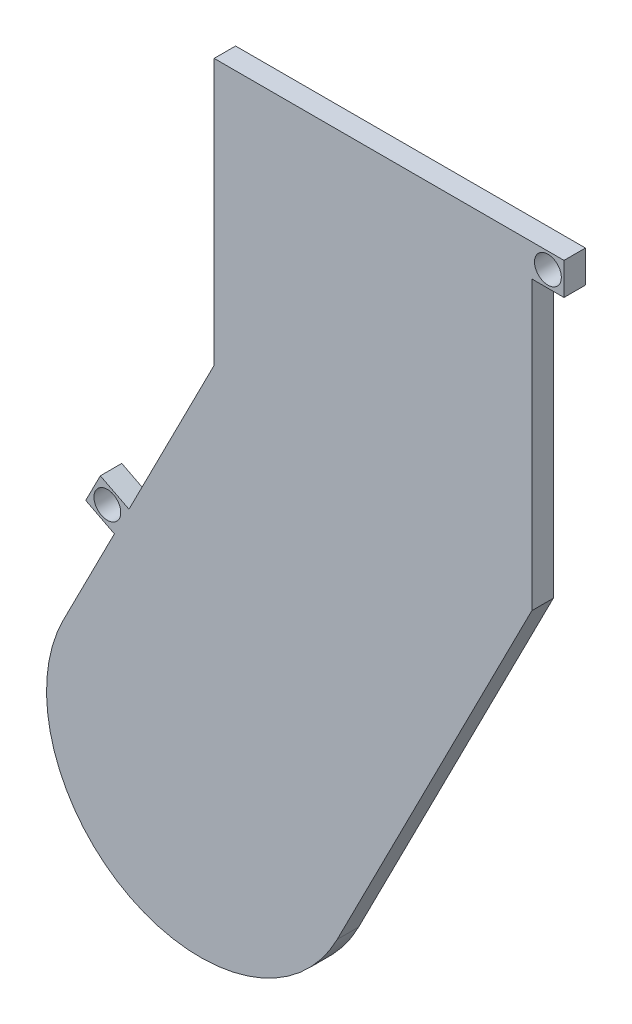
ISO-10303-21;
HEADER;
FILE_DESCRIPTION(('STEP AP214'),'2;1');
FILE_NAME('part.step','',(''),(''),'','','');
FILE_SCHEMA(('AUTOMOTIVE_DESIGN { 1 0 10303 214 1 1 1 1 }'));
ENDSEC;
DATA;
#1=APPLICATION_CONTEXT('core data for automotive mechanical design processes');
#2=APPLICATION_PROTOCOL_DEFINITION('international standard','automotive_design',2000,#1);
#3=PRODUCT_CONTEXT('',#1,'mechanical');
#4=PRODUCT('Part','Part','',(#3));
#5=PRODUCT_RELATED_PRODUCT_CATEGORY('part','',(#4));
#6=PRODUCT_DEFINITION_FORMATION('','',#4);
#7=PRODUCT_DEFINITION_CONTEXT('part definition',#1,'design');
#8=PRODUCT_DEFINITION('design','',#6,#7);
#9=PRODUCT_DEFINITION_SHAPE('','',#8);
#10=(LENGTH_UNIT() NAMED_UNIT(*) SI_UNIT(.MILLI.,.METRE.));
#11=(NAMED_UNIT(*) PLANE_ANGLE_UNIT() SI_UNIT($,.RADIAN.));
#12=(NAMED_UNIT(*) SI_UNIT($,.STERADIAN.) SOLID_ANGLE_UNIT());
#13=UNCERTAINTY_MEASURE_WITH_UNIT(LENGTH_MEASURE(1.E-05),#10,'distance_accuracy_value','');
#14=(GEOMETRIC_REPRESENTATION_CONTEXT(3) GLOBAL_UNCERTAINTY_ASSIGNED_CONTEXT((#13)) GLOBAL_UNIT_ASSIGNED_CONTEXT((#10,
#11,#12)) REPRESENTATION_CONTEXT('',''));
#15=CARTESIAN_POINT('',(0.,0.,0.));
#16=DIRECTION('',(0.,0.,1.));
#17=DIRECTION('',(1.,0.,0.));
#18=AXIS2_PLACEMENT_3D('',#15,#16,#17);
#19=CARTESIAN_POINT('',(-78.5756383656822,-149.684058286065,5.08));
#20=DIRECTION('',(0.,0.,1.));
#21=DIRECTION('',(1.,0.,0.));
#22=AXIS2_PLACEMENT_3D('',#19,#20,#21);
#23=PLANE('',#22);
#24=CARTESIAN_POINT('',(3.81,-3.81,5.08));
#25=DIRECTION('',(0.,0.,1.));
#26=DIRECTION('',(1.,0.,0.));
#27=AXIS2_PLACEMENT_3D('',#24,#25,#26);
#28=CIRCLE('',#27,3.175);
#29=CARTESIAN_POINT('',(6.985,-3.81,5.08));
#30=VERTEX_POINT('',#29);
#31=EDGE_CURVE('E170',#30,#30,#28,.T.);
#32=ORIENTED_EDGE('',*,*,#31,.F.);
#33=EDGE_LOOP('',(#32));
#34=FACE_BOUND('',#33,.T.);
#35=DIRECTION('',(-0.453990499739548,-0.891006524188367,0.));
#36=VECTOR('',#35,1.);
#37=CARTESIAN_POINT('',(-75.2786300083344,-62.992,5.08));
#38=LINE('',#37,#36);
#39=CARTESIAN_POINT('',(-75.2786300083344,-62.992,5.08));
#40=VERTEX_POINT('',#39);
#41=CARTESIAN_POINT('',(-95.4585077217573,-102.597240000173,5.08));
#42=VERTEX_POINT('',#41);
#43=EDGE_CURVE('E200',#40,#42,#38,.T.);
#44=ORIENTED_EDGE('',*,*,#43,.T.);
#45=DIRECTION('',(-0.891006524188368,0.453990499739547,0.));
#46=VECTOR('',#45,1.);
#47=CARTESIAN_POINT('',(-95.4585077217573,-102.597240000173,5.08));
#48=LINE('',#47,#46);
#49=CARTESIAN_POINT('',(-102.247977436073,-99.1378323921576,5.08));
#50=VERTEX_POINT('',#49);
#51=EDGE_CURVE('E111',#42,#50,#48,.T.);
#52=ORIENTED_EDGE('',*,*,#51,.T.);
#53=DIRECTION('',(-0.453990499739546,-0.891006524188368,0.));
#54=VECTOR('',#53,1.);
#55=CARTESIAN_POINT('',(-102.247977436073,-99.1378323921576,5.08));
#56=LINE('',#55,#54);
#57=CARTESIAN_POINT('',(-105.707385044088,-105.927302106473,5.08));
#58=VERTEX_POINT('',#57);
#59=EDGE_CURVE('E237',#50,#58,#56,.T.);
#60=ORIENTED_EDGE('',*,*,#59,.T.);
#61=DIRECTION('',(0.891006524188366,-0.453990499739552,0.));
#62=VECTOR('',#61,1.);
#63=CARTESIAN_POINT('',(-105.707385044088,-105.927302106473,5.08));
#64=LINE('',#63,#62);
#65=CARTESIAN_POINT('',(-98.9179153297727,-109.386709714488,5.08));
#66=VERTEX_POINT('',#65);
#67=EDGE_CURVE('E257',#58,#66,#64,.T.);
#68=ORIENTED_EDGE('',*,*,#67,.T.);
#69=DIRECTION('',(-0.453990499739547,-0.891006524188368,0.));
#70=VECTOR('',#69,1.);
#71=CARTESIAN_POINT('',(-98.9179153297727,-109.386709714488,5.08));
#72=LINE('',#71,#70);
#73=CARTESIAN_POINT('',(-111.025841957826,-133.149853714592,5.08));
#74=VERTEX_POINT('',#73);
#75=EDGE_CURVE('E253',#66,#74,#72,.T.);
#76=ORIENTED_EDGE('',*,*,#75,.T.);
#77=CARTESIAN_POINT('',(-78.5756383656822,-149.684058286065,5.08));
#78=DIRECTION('',(0.,0.,1.));
#79=DIRECTION('',(1.,0.,0.));
#80=AXIS2_PLACEMENT_3D('',#77,#78,#79);
#81=CIRCLE('',#80,36.4197149080402);
#82=CARTESIAN_POINT('',(-46.1254347735381,-166.218262857538,5.08));
#83=VERTEX_POINT('',#82);
#84=EDGE_CURVE('E256',#74,#83,#81,.T.);
#85=ORIENTED_EDGE('',*,*,#84,.T.);
#86=DIRECTION('',(0.453990499739548,0.891006524188368,0.));
#87=VECTOR('',#86,1.);
#88=CARTESIAN_POINT('',(0.,-75.692,5.08));
#89=LINE('',#88,#87);
#90=CARTESIAN_POINT('',(0.,-75.692,5.08));
#91=VERTEX_POINT('',#90);
#92=EDGE_CURVE('E261',#83,#91,#89,.T.);
#93=ORIENTED_EDGE('',*,*,#92,.T.);
#94=DIRECTION('',(0.,1.,0.));
#95=VECTOR('',#94,1.);
#96=CARTESIAN_POINT('',(0.,-7.62,5.08));
#97=LINE('',#96,#95);
#98=CARTESIAN_POINT('',(0.,-7.62,5.08));
#99=VERTEX_POINT('',#98);
#100=EDGE_CURVE('E268',#91,#99,#97,.T.);
#101=ORIENTED_EDGE('',*,*,#100,.T.);
#102=DIRECTION('',(1.,0.,0.));
#103=VECTOR('',#102,1.);
#104=CARTESIAN_POINT('',(7.62,-7.62,5.08));
#105=LINE('',#104,#103);
#106=CARTESIAN_POINT('',(7.62,-7.62,5.08));
#107=VERTEX_POINT('',#106);
#108=EDGE_CURVE('E142',#99,#107,#105,.T.);
#109=ORIENTED_EDGE('',*,*,#108,.T.);
#110=DIRECTION('',(0.,1.,0.));
#111=VECTOR('',#110,1.);
#112=CARTESIAN_POINT('',(7.62,0.,5.08));
#113=LINE('',#112,#111);
#114=CARTESIAN_POINT('',(7.62,0.,5.08));
#115=VERTEX_POINT('',#114);
#116=EDGE_CURVE('E136',#107,#115,#113,.T.);
#117=ORIENTED_EDGE('',*,*,#116,.T.);
#118=DIRECTION('',(-1.,0.,0.));
#119=VECTOR('',#118,1.);
#120=CARTESIAN_POINT('',(0.,0.,5.08));
#121=LINE('',#120,#119);
#122=CARTESIAN_POINT('',(-75.2786300083344,0.,5.08));
#123=VERTEX_POINT('',#122);
#124=EDGE_CURVE('E140',#115,#123,#121,.T.);
#125=ORIENTED_EDGE('',*,*,#124,.T.);
#126=DIRECTION('',(0.,-1.,0.));
#127=VECTOR('',#126,1.);
#128=CARTESIAN_POINT('',(-75.2786300083344,0.,5.08));
#129=LINE('',#128,#127);
#130=EDGE_CURVE('E57',#123,#40,#129,.T.);
#131=ORIENTED_EDGE('',*,*,#130,.T.);
#132=EDGE_LOOP('',(#44,#52,#60,#68,#76,#85,#93,#101,#109,#117,#125,#131));
#133=FACE_BOUND('',#132,.T.);
#134=CARTESIAN_POINT('',(-100.582946382923,-104.262271053323,5.08));
#135=DIRECTION('',(0.,0.,1.));
#136=DIRECTION('',(1.,0.,0.));
#137=AXIS2_PLACEMENT_3D('',#134,#135,#136);
#138=CIRCLE('',#137,3.175);
#139=CARTESIAN_POINT('',(-97.4079463829227,-104.262271053323,5.08));
#140=VERTEX_POINT('',#139);
#141=EDGE_CURVE('E312',#140,#140,#138,.T.);
#142=ORIENTED_EDGE('',*,*,#141,.F.);
#143=EDGE_LOOP('',(#142));
#144=FACE_BOUND('',#143,.T.);
#145=ADVANCED_FACE('F39',(#34,#133,#144),#23,.T.);
#146=CARTESIAN_POINT('',(-78.5756383656822,-149.684058286065,0.));
#147=DIRECTION('',(0.,0.,1.));
#148=DIRECTION('',(1.,0.,0.));
#149=AXIS2_PLACEMENT_3D('',#146,#147,#148);
#150=PLANE('',#149);
#151=DIRECTION('',(-0.453990499739548,-0.891006524188367,0.));
#152=VECTOR('',#151,1.);
#153=CARTESIAN_POINT('',(-75.2786300083344,-62.992,0.));
#154=LINE('',#153,#152);
#155=CARTESIAN_POINT('',(-75.2786300083344,-62.992,0.));
#156=VERTEX_POINT('',#155);
#157=CARTESIAN_POINT('',(-95.4585077217573,-102.597240000173,0.));
#158=VERTEX_POINT('',#157);
#159=EDGE_CURVE('E165',#156,#158,#154,.T.);
#160=ORIENTED_EDGE('',*,*,#159,.F.);
#161=DIRECTION('',(0.,-1.,0.));
#162=VECTOR('',#161,1.);
#163=CARTESIAN_POINT('',(-75.2786300083344,0.,0.));
#164=LINE('',#163,#162);
#165=CARTESIAN_POINT('',(-75.2786300083344,0.,0.));
#166=VERTEX_POINT('',#165);
#167=EDGE_CURVE('E103',#166,#156,#164,.T.);
#168=ORIENTED_EDGE('',*,*,#167,.F.);
#169=DIRECTION('',(-1.,0.,0.));
#170=VECTOR('',#169,1.);
#171=CARTESIAN_POINT('',(-75.2786300083344,0.,0.));
#172=LINE('',#171,#170);
#173=CARTESIAN_POINT('',(7.62,0.,0.));
#174=VERTEX_POINT('',#173);
#175=EDGE_CURVE('E97',#174,#166,#172,.T.);
#176=ORIENTED_EDGE('',*,*,#175,.F.);
#177=DIRECTION('',(0.,1.,0.));
#178=VECTOR('',#177,1.);
#179=CARTESIAN_POINT('',(7.62,0.,0.));
#180=LINE('',#179,#178);
#181=CARTESIAN_POINT('',(7.62,-7.62,0.));
#182=VERTEX_POINT('',#181);
#183=EDGE_CURVE('E152',#182,#174,#180,.T.);
#184=ORIENTED_EDGE('',*,*,#183,.F.);
#185=DIRECTION('',(1.,0.,0.));
#186=VECTOR('',#185,1.);
#187=CARTESIAN_POINT('',(7.62,-7.62,0.));
#188=LINE('',#187,#186);
#189=CARTESIAN_POINT('',(0.,-7.62,0.));
#190=VERTEX_POINT('',#189);
#191=EDGE_CURVE('E191',#190,#182,#188,.T.);
#192=ORIENTED_EDGE('',*,*,#191,.F.);
#193=DIRECTION('',(0.,1.,0.));
#194=VECTOR('',#193,1.);
#195=CARTESIAN_POINT('',(0.,-7.62,0.));
#196=LINE('',#195,#194);
#197=CARTESIAN_POINT('',(0.,-75.692,0.));
#198=VERTEX_POINT('',#197);
#199=EDGE_CURVE('E188',#198,#190,#196,.T.);
#200=ORIENTED_EDGE('',*,*,#199,.F.);
#201=DIRECTION('',(0.453990499739548,0.891006524188368,0.));
#202=VECTOR('',#201,1.);
#203=CARTESIAN_POINT('',(0.,-75.692,0.));
#204=LINE('',#203,#202);
#205=CARTESIAN_POINT('',(-46.1254347735381,-166.218262857538,0.));
#206=VERTEX_POINT('',#205);
#207=EDGE_CURVE('E185',#206,#198,#204,.T.);
#208=ORIENTED_EDGE('',*,*,#207,.F.);
#209=CARTESIAN_POINT('',(-78.5756383656822,-149.684058286065,0.));
#210=DIRECTION('',(0.,0.,1.));
#211=DIRECTION('',(1.,0.,0.));
#212=AXIS2_PLACEMENT_3D('',#209,#210,#211);
#213=CIRCLE('',#212,36.4197149080402);
#214=CARTESIAN_POINT('',(-111.025841957826,-133.149853714592,0.));
#215=VERTEX_POINT('',#214);
#216=EDGE_CURVE('E182',#215,#206,#213,.T.);
#217=ORIENTED_EDGE('',*,*,#216,.F.);
#218=DIRECTION('',(-0.453990499739547,-0.891006524188368,0.));
#219=VECTOR('',#218,1.);
#220=CARTESIAN_POINT('',(-98.9179153297727,-109.386709714488,0.));
#221=LINE('',#220,#219);
#222=CARTESIAN_POINT('',(-98.9179153297727,-109.386709714488,0.));
#223=VERTEX_POINT('',#222);
#224=EDGE_CURVE('E179',#223,#215,#221,.T.);
#225=ORIENTED_EDGE('',*,*,#224,.F.);
#226=DIRECTION('',(0.891006524188366,-0.453990499739552,0.));
#227=VECTOR('',#226,1.);
#228=CARTESIAN_POINT('',(-105.707385044088,-105.927302106473,0.));
#229=LINE('',#228,#227);
#230=CARTESIAN_POINT('',(-105.707385044088,-105.927302106473,0.));
#231=VERTEX_POINT('',#230);
#232=EDGE_CURVE('E176',#231,#223,#229,.T.);
#233=ORIENTED_EDGE('',*,*,#232,.F.);
#234=DIRECTION('',(-0.453990499739546,-0.891006524188368,0.));
#235=VECTOR('',#234,1.);
#236=CARTESIAN_POINT('',(-102.247977436073,-99.1378323921576,0.));
#237=LINE('',#236,#235);
#238=CARTESIAN_POINT('',(-102.247977436073,-99.1378323921576,0.));
#239=VERTEX_POINT('',#238);
#240=EDGE_CURVE('E173',#239,#231,#237,.T.);
#241=ORIENTED_EDGE('',*,*,#240,.F.);
#242=DIRECTION('',(-0.891006524188368,0.453990499739547,0.));
#243=VECTOR('',#242,1.);
#244=CARTESIAN_POINT('',(-95.4585077217573,-102.597240000173,0.));
#245=LINE('',#244,#243);
#246=EDGE_CURVE('E169',#158,#239,#245,.T.);
#247=ORIENTED_EDGE('',*,*,#246,.F.);
#248=EDGE_LOOP('',(#160,#168,#176,#184,#192,#200,#208,#217,#225,#233,#241,#247));
#249=FACE_BOUND('',#248,.T.);
#250=CARTESIAN_POINT('',(3.81,-3.81,0.));
#251=DIRECTION('',(0.,0.,1.));
#252=DIRECTION('',(1.,0.,0.));
#253=AXIS2_PLACEMENT_3D('',#250,#251,#252);
#254=CIRCLE('',#253,3.175);
#255=CARTESIAN_POINT('',(6.985,-3.81,0.));
#256=VERTEX_POINT('',#255);
#257=EDGE_CURVE('E320',#256,#256,#254,.T.);
#258=ORIENTED_EDGE('',*,*,#257,.T.);
#259=EDGE_LOOP('',(#258));
#260=FACE_BOUND('',#259,.T.);
#261=CARTESIAN_POINT('',(-100.582946382923,-104.262271053323,0.));
#262=DIRECTION('',(0.,0.,1.));
#263=DIRECTION('',(1.,0.,0.));
#264=AXIS2_PLACEMENT_3D('',#261,#262,#263);
#265=CIRCLE('',#264,3.175);
#266=CARTESIAN_POINT('',(-97.4079463829227,-104.262271053323,0.));
#267=VERTEX_POINT('',#266);
#268=EDGE_CURVE('E315',#267,#267,#265,.T.);
#269=ORIENTED_EDGE('',*,*,#268,.T.);
#270=EDGE_LOOP('',(#269));
#271=FACE_BOUND('',#270,.T.);
#272=ADVANCED_FACE('F241',(#249,#260,#271),#150,.F.);
#273=CARTESIAN_POINT('',(-75.2786300083344,-62.992,5.08));
#274=DIRECTION('',(0.891006524188368,-0.453990499739548,0.));
#275=DIRECTION('',(0.453990499739548,0.891006524188368,0.));
#276=AXIS2_PLACEMENT_3D('',#273,#274,#275);
#277=PLANE('',#276);
#278=ORIENTED_EDGE('',*,*,#159,.T.);
#279=DIRECTION('',(0.,0.,-1.));
#280=VECTOR('',#279,1.);
#281=CARTESIAN_POINT('',(-95.4585077217573,-102.597240000173,5.08));
#282=LINE('',#281,#280);
#283=EDGE_CURVE('E11',#42,#158,#282,.T.);
#284=ORIENTED_EDGE('',*,*,#283,.F.);
#285=ORIENTED_EDGE('',*,*,#43,.F.);
#286=DIRECTION('',(0.,0.,-1.));
#287=VECTOR('',#286,1.);
#288=CARTESIAN_POINT('',(-75.2786300083344,-62.992,5.08));
#289=LINE('',#288,#287);
#290=EDGE_CURVE('E161',#40,#156,#289,.T.);
#291=ORIENTED_EDGE('',*,*,#290,.T.);
#292=EDGE_LOOP('',(#278,#284,#285,#291));
#293=FACE_BOUND('',#292,.T.);
#294=ADVANCED_FACE('F41',(#293),#277,.F.);
#295=CARTESIAN_POINT('',(-95.4585077217573,-102.597240000173,5.08));
#296=DIRECTION('',(-0.453990499739547,-0.891006524188368,0.));
#297=DIRECTION('',(0.891006524188368,-0.453990499739547,0.));
#298=AXIS2_PLACEMENT_3D('',#295,#296,#297);
#299=PLANE('',#298);
#300=ORIENTED_EDGE('',*,*,#246,.T.);
#301=DIRECTION('',(0.,0.,-1.));
#302=VECTOR('',#301,1.);
#303=CARTESIAN_POINT('',(-102.247977436073,-99.1378323921576,5.08));
#304=LINE('',#303,#302);
#305=EDGE_CURVE('E49',#50,#239,#304,.T.);
#306=ORIENTED_EDGE('',*,*,#305,.F.);
#307=ORIENTED_EDGE('',*,*,#51,.F.);
#308=ORIENTED_EDGE('',*,*,#283,.T.);
#309=EDGE_LOOP('',(#300,#306,#307,#308));
#310=FACE_BOUND('',#309,.T.);
#311=ADVANCED_FACE('F419',(#310),#299,.F.);
#312=CARTESIAN_POINT('',(-102.247977436073,-99.1378323921576,5.08));
#313=DIRECTION('',(0.891006524188368,-0.453990499739547,0.));
#314=DIRECTION('',(0.453990499739547,0.891006524188368,0.));
#315=AXIS2_PLACEMENT_3D('',#312,#313,#314);
#316=PLANE('',#315);
#317=ORIENTED_EDGE('',*,*,#240,.T.);
#318=DIRECTION('',(0.,0.,-1.));
#319=VECTOR('',#318,1.);
#320=CARTESIAN_POINT('',(-105.707385044088,-105.927302106473,5.08));
#321=LINE('',#320,#319);
#322=EDGE_CURVE('E227',#58,#231,#321,.T.);
#323=ORIENTED_EDGE('',*,*,#322,.F.);
#324=ORIENTED_EDGE('',*,*,#59,.F.);
#325=ORIENTED_EDGE('',*,*,#305,.T.);
#326=EDGE_LOOP('',(#317,#323,#324,#325));
#327=FACE_BOUND('',#326,.T.);
#328=ADVANCED_FACE('F235',(#327),#316,.F.);
#329=CARTESIAN_POINT('',(-105.707385044088,-105.927302106473,5.08));
#330=DIRECTION('',(0.453990499739552,0.891006524188365,0.));
#331=DIRECTION('',(-0.891006524188365,0.453990499739552,0.));
#332=AXIS2_PLACEMENT_3D('',#329,#330,#331);
#333=PLANE('',#332);
#334=ORIENTED_EDGE('',*,*,#232,.T.);
#335=DIRECTION('',(0.,0.,-1.));
#336=VECTOR('',#335,1.);
#337=CARTESIAN_POINT('',(-98.9179153297727,-109.386709714488,5.08));
#338=LINE('',#337,#336);
#339=EDGE_CURVE('E223',#66,#223,#338,.T.);
#340=ORIENTED_EDGE('',*,*,#339,.F.);
#341=ORIENTED_EDGE('',*,*,#67,.F.);
#342=ORIENTED_EDGE('',*,*,#322,.T.);
#343=EDGE_LOOP('',(#334,#340,#341,#342));
#344=FACE_BOUND('',#343,.T.);
#345=ADVANCED_FACE('F247',(#344),#333,.F.);
#346=CARTESIAN_POINT('',(-98.9179153297727,-109.386709714488,5.08));
#347=DIRECTION('',(0.891006524188368,-0.453990499739547,0.));
#348=DIRECTION('',(0.453990499739547,0.891006524188368,0.));
#349=AXIS2_PLACEMENT_3D('',#346,#347,#348);
#350=PLANE('',#349);
#351=ORIENTED_EDGE('',*,*,#224,.T.);
#352=DIRECTION('',(0.,0.,-1.));
#353=VECTOR('',#352,1.);
#354=CARTESIAN_POINT('',(-111.025841957826,-133.149853714592,5.08));
#355=LINE('',#354,#353);
#356=EDGE_CURVE('E219',#74,#215,#355,.T.);
#357=ORIENTED_EDGE('',*,*,#356,.F.);
#358=ORIENTED_EDGE('',*,*,#75,.F.);
#359=ORIENTED_EDGE('',*,*,#339,.T.);
#360=EDGE_LOOP('',(#351,#357,#358,#359));
#361=FACE_BOUND('',#360,.T.);
#362=ADVANCED_FACE('F251',(#361),#350,.F.);
#363=CARTESIAN_POINT('',(-78.5756383656822,-149.684058286065,5.08));
#364=DIRECTION('',(0.,0.,-1.));
#365=DIRECTION('',(-1.,0.,0.));
#366=AXIS2_PLACEMENT_3D('',#363,#364,#365);
#367=CYLINDRICAL_SURFACE('',#366,36.4197149080402);
#368=ORIENTED_EDGE('',*,*,#216,.T.);
#369=DIRECTION('',(0.,0.,-1.));
#370=VECTOR('',#369,1.);
#371=CARTESIAN_POINT('',(-46.1254347735381,-166.218262857538,5.08));
#372=LINE('',#371,#370);
#373=EDGE_CURVE('E215',#83,#206,#372,.T.);
#374=ORIENTED_EDGE('',*,*,#373,.F.);
#375=ORIENTED_EDGE('',*,*,#84,.F.);
#376=ORIENTED_EDGE('',*,*,#356,.T.);
#377=EDGE_LOOP('',(#368,#374,#375,#376));
#378=FACE_BOUND('',#377,.T.);
#379=ADVANCED_FACE('F384',(#378),#367,.T.);
#380=CARTESIAN_POINT('',(0.,-75.692,5.08));
#381=DIRECTION('',(-0.891006524188367,0.453990499739548,0.));
#382=DIRECTION('',(-0.453990499739548,-0.891006524188368,0.));
#383=AXIS2_PLACEMENT_3D('',#380,#381,#382);
#384=PLANE('',#383);
#385=ORIENTED_EDGE('',*,*,#207,.T.);
#386=DIRECTION('',(0.,0.,-1.));
#387=VECTOR('',#386,1.);
#388=CARTESIAN_POINT('',(0.,-75.692,5.08));
#389=LINE('',#388,#387);
#390=EDGE_CURVE('E211',#91,#198,#389,.T.);
#391=ORIENTED_EDGE('',*,*,#390,.F.);
#392=ORIENTED_EDGE('',*,*,#92,.F.);
#393=ORIENTED_EDGE('',*,*,#373,.T.);
#394=EDGE_LOOP('',(#385,#391,#392,#393));
#395=FACE_BOUND('',#394,.T.);
#396=ADVANCED_FACE('F375',(#395),#384,.F.);
#397=CARTESIAN_POINT('',(0.,-7.62,5.08));
#398=DIRECTION('',(-1.,0.,0.));
#399=DIRECTION('',(0.,-1.,0.));
#400=AXIS2_PLACEMENT_3D('',#397,#398,#399);
#401=PLANE('',#400);
#402=ORIENTED_EDGE('',*,*,#199,.T.);
#403=DIRECTION('',(0.,0.,-1.));
#404=VECTOR('',#403,1.);
#405=CARTESIAN_POINT('',(0.,-7.62,5.08));
#406=LINE('',#405,#404);
#407=EDGE_CURVE('E207',#99,#190,#406,.T.);
#408=ORIENTED_EDGE('',*,*,#407,.F.);
#409=ORIENTED_EDGE('',*,*,#100,.F.);
#410=ORIENTED_EDGE('',*,*,#390,.T.);
#411=EDGE_LOOP('',(#402,#408,#409,#410));
#412=FACE_BOUND('',#411,.T.);
#413=ADVANCED_FACE('F276',(#412),#401,.F.);
#414=CARTESIAN_POINT('',(7.62,-7.62,5.08));
#415=DIRECTION('',(0.,1.,0.));
#416=DIRECTION('',(-1.,0.,0.));
#417=AXIS2_PLACEMENT_3D('',#414,#415,#416);
#418=PLANE('',#417);
#419=ORIENTED_EDGE('',*,*,#191,.T.);
#420=DIRECTION('',(0.,0.,-1.));
#421=VECTOR('',#420,1.);
#422=CARTESIAN_POINT('',(7.62,-7.62,5.08));
#423=LINE('',#422,#421);
#424=EDGE_CURVE('E154',#107,#182,#423,.T.);
#425=ORIENTED_EDGE('',*,*,#424,.F.);
#426=ORIENTED_EDGE('',*,*,#108,.F.);
#427=ORIENTED_EDGE('',*,*,#407,.T.);
#428=EDGE_LOOP('',(#419,#425,#426,#427));
#429=FACE_BOUND('',#428,.T.);
#430=ADVANCED_FACE('F280',(#429),#418,.F.);
#431=CARTESIAN_POINT('',(7.62,0.,5.08));
#432=DIRECTION('',(-1.,0.,0.));
#433=DIRECTION('',(0.,-1.,0.));
#434=AXIS2_PLACEMENT_3D('',#431,#432,#433);
#435=PLANE('',#434);
#436=ORIENTED_EDGE('',*,*,#183,.T.);
#437=DIRECTION('',(0.,0.,-1.));
#438=VECTOR('',#437,1.);
#439=CARTESIAN_POINT('',(7.62,0.,5.08));
#440=LINE('',#439,#438);
#441=EDGE_CURVE('E149',#115,#174,#440,.T.);
#442=ORIENTED_EDGE('',*,*,#441,.F.);
#443=ORIENTED_EDGE('',*,*,#116,.F.);
#444=ORIENTED_EDGE('',*,*,#424,.T.);
#445=EDGE_LOOP('',(#436,#442,#443,#444));
#446=FACE_BOUND('',#445,.T.);
#447=ADVANCED_FACE('F150',(#446),#435,.F.);
#448=CARTESIAN_POINT('',(-75.2786300083344,0.,5.08));
#449=DIRECTION('',(0.,-1.,0.));
#450=DIRECTION('',(0.,0.,-1.));
#451=AXIS2_PLACEMENT_3D('',#448,#449,#450);
#452=PLANE('',#451);
#453=ORIENTED_EDGE('',*,*,#175,.T.);
#454=DIRECTION('',(0.,0.,-1.));
#455=VECTOR('',#454,1.);
#456=CARTESIAN_POINT('',(-75.2786300083344,0.,5.08));
#457=LINE('',#456,#455);
#458=EDGE_CURVE('E155',#123,#166,#457,.T.);
#459=ORIENTED_EDGE('',*,*,#458,.F.);
#460=ORIENTED_EDGE('',*,*,#124,.F.);
#461=ORIENTED_EDGE('',*,*,#441,.T.);
#462=EDGE_LOOP('',(#453,#459,#460,#461));
#463=FACE_BOUND('',#462,.T.);
#464=ADVANCED_FACE('F157',(#463),#452,.F.);
#465=CARTESIAN_POINT('',(-75.2786300083344,0.,5.08));
#466=DIRECTION('',(1.,0.,0.));
#467=DIRECTION('',(0.,0.,-1.));
#468=AXIS2_PLACEMENT_3D('',#465,#466,#467);
#469=PLANE('',#468);
#470=ORIENTED_EDGE('',*,*,#167,.T.);
#471=ORIENTED_EDGE('',*,*,#290,.F.);
#472=ORIENTED_EDGE('',*,*,#130,.F.);
#473=ORIENTED_EDGE('',*,*,#458,.T.);
#474=EDGE_LOOP('',(#470,#471,#472,#473));
#475=FACE_BOUND('',#474,.T.);
#476=ADVANCED_FACE('F284',(#475),#469,.F.);
#477=CARTESIAN_POINT('',(3.81,-3.81,5.08));
#478=DIRECTION('',(0.,0.,-1.));
#479=DIRECTION('',(-1.,0.,0.));
#480=AXIS2_PLACEMENT_3D('',#477,#478,#479);
#481=CYLINDRICAL_SURFACE('',#480,3.175);
#482=ORIENTED_EDGE('',*,*,#31,.T.);
#483=EDGE_LOOP('',(#482));
#484=FACE_BOUND('',#483,.T.);
#485=ORIENTED_EDGE('',*,*,#257,.F.);
#486=EDGE_LOOP('',(#485));
#487=FACE_BOUND('',#486,.T.);
#488=ADVANCED_FACE('F286',(#484,#487),#481,.F.);
#489=CARTESIAN_POINT('',(-100.582946382923,-104.262271053323,5.08));
#490=DIRECTION('',(0.,0.,-1.));
#491=DIRECTION('',(-1.,0.,0.));
#492=AXIS2_PLACEMENT_3D('',#489,#490,#491);
#493=CYLINDRICAL_SURFACE('',#492,3.175);
#494=ORIENTED_EDGE('',*,*,#141,.T.);
#495=EDGE_LOOP('',(#494));
#496=FACE_BOUND('',#495,.T.);
#497=ORIENTED_EDGE('',*,*,#268,.F.);
#498=EDGE_LOOP('',(#497));
#499=FACE_BOUND('',#498,.T.);
#500=ADVANCED_FACE('F292',(#496,#499),#493,.F.);
#501=CLOSED_SHELL('',(#145,#272,#294,#311,#328,#345,#362,#379,#396,#413,#430,#447,#464,#476,
#488,#500));
#502=MANIFOLD_SOLID_BREP('B2',#501);
#503=ADVANCED_BREP_SHAPE_REPRESENTATION('',(#18,#502),#14);
#504=SHAPE_DEFINITION_REPRESENTATION(#9,#503);
ENDSEC;
END-ISO-10303-21;
